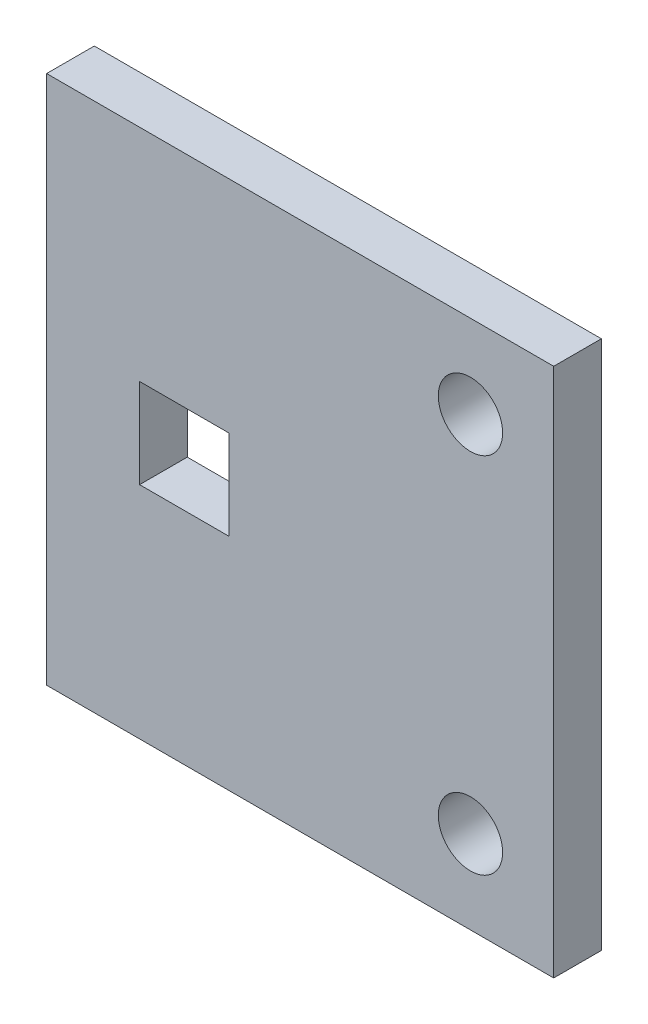
ISO-10303-21;
HEADER;
FILE_DESCRIPTION(('STEP AP214'),'2;1');
FILE_NAME('part.step','',(''),(''),'','','');
FILE_SCHEMA(('AUTOMOTIVE_DESIGN { 1 0 10303 214 1 1 1 1 }'));
ENDSEC;
DATA;
#1=APPLICATION_CONTEXT('core data for automotive mechanical design processes');
#2=APPLICATION_PROTOCOL_DEFINITION('international standard','automotive_design',2000,#1);
#3=PRODUCT_CONTEXT('',#1,'mechanical');
#4=PRODUCT('Part','Part','',(#3));
#5=PRODUCT_RELATED_PRODUCT_CATEGORY('part','',(#4));
#6=PRODUCT_DEFINITION_FORMATION('','',#4);
#7=PRODUCT_DEFINITION_CONTEXT('part definition',#1,'design');
#8=PRODUCT_DEFINITION('design','',#6,#7);
#9=PRODUCT_DEFINITION_SHAPE('','',#8);
#10=(LENGTH_UNIT() NAMED_UNIT(*) SI_UNIT(.MILLI.,.METRE.));
#11=(NAMED_UNIT(*) PLANE_ANGLE_UNIT() SI_UNIT($,.RADIAN.));
#12=(NAMED_UNIT(*) SI_UNIT($,.STERADIAN.) SOLID_ANGLE_UNIT());
#13=UNCERTAINTY_MEASURE_WITH_UNIT(LENGTH_MEASURE(1.E-05),#10,'distance_accuracy_value','');
#14=(GEOMETRIC_REPRESENTATION_CONTEXT(3) GLOBAL_UNCERTAINTY_ASSIGNED_CONTEXT((#13)) GLOBAL_UNIT_ASSIGNED_CONTEXT((#10,
#11,#12)) REPRESENTATION_CONTEXT('',''));
#15=CARTESIAN_POINT('',(0.,0.,0.));
#16=DIRECTION('',(0.,0.,1.));
#17=DIRECTION('',(1.,0.,0.));
#18=AXIS2_PLACEMENT_3D('',#15,#16,#17);
#19=CARTESIAN_POINT('',(-5.389,0.,1.6));
#20=DIRECTION('',(1.,0.,0.));
#21=DIRECTION('',(0.,0.,-1.));
#22=AXIS2_PLACEMENT_3D('',#19,#20,#21);
#23=PLANE('',#22);
#24=DIRECTION('',(0.,-1.,0.));
#25=VECTOR('',#24,1.);
#26=CARTESIAN_POINT('',(-5.389,0.,0.));
#27=LINE('',#26,#25);
#28=CARTESIAN_POINT('',(-5.389,1.5,0.));
#29=VERTEX_POINT('',#28);
#30=CARTESIAN_POINT('',(-5.389,-1.5,0.));
#31=VERTEX_POINT('',#30);
#32=EDGE_CURVE('E156',#29,#31,#27,.T.);
#33=ORIENTED_EDGE('',*,*,#32,.F.);
#34=DIRECTION('',(0.,0.,-1.));
#35=VECTOR('',#34,1.);
#36=CARTESIAN_POINT('',(-5.389,1.5,1.6));
#37=LINE('',#36,#35);
#38=CARTESIAN_POINT('',(-5.389,1.5,1.6));
#39=VERTEX_POINT('',#38);
#40=EDGE_CURVE('E11',#39,#29,#37,.T.);
#41=ORIENTED_EDGE('',*,*,#40,.F.);
#42=DIRECTION('',(0.,-1.,0.));
#43=VECTOR('',#42,1.);
#44=CARTESIAN_POINT('',(-5.389,0.,1.6));
#45=LINE('',#44,#43);
#46=CARTESIAN_POINT('',(-5.389,-1.5,1.6));
#47=VERTEX_POINT('',#46);
#48=EDGE_CURVE('E130',#39,#47,#45,.T.);
#49=ORIENTED_EDGE('',*,*,#48,.T.);
#50=DIRECTION('',(0.,0.,-1.));
#51=VECTOR('',#50,1.);
#52=CARTESIAN_POINT('',(-5.389,-1.5,1.6));
#53=LINE('',#52,#51);
#54=EDGE_CURVE('E90',#47,#31,#53,.T.);
#55=ORIENTED_EDGE('',*,*,#54,.T.);
#56=EDGE_LOOP('',(#33,#41,#49,#55));
#57=FACE_BOUND('',#56,.T.);
#58=ADVANCED_FACE('F36',(#57),#23,.T.);
#59=CARTESIAN_POINT('',(0.,1.5,1.6));
#60=DIRECTION('',(0.,-1.,0.));
#61=DIRECTION('',(1.,0.,0.));
#62=AXIS2_PLACEMENT_3D('',#59,#60,#61);
#63=PLANE('',#62);
#64=DIRECTION('',(-1.,0.,0.));
#65=VECTOR('',#64,1.);
#66=CARTESIAN_POINT('',(0.,1.5,0.));
#67=LINE('',#66,#65);
#68=CARTESIAN_POINT('',(-2.389,1.5,0.));
#69=VERTEX_POINT('',#68);
#70=EDGE_CURVE('E119',#69,#29,#67,.T.);
#71=ORIENTED_EDGE('',*,*,#70,.F.);
#72=DIRECTION('',(0.,0.,-1.));
#73=VECTOR('',#72,1.);
#74=CARTESIAN_POINT('',(-2.389,1.5,1.6));
#75=LINE('',#74,#73);
#76=CARTESIAN_POINT('',(-2.389,1.5,1.6));
#77=VERTEX_POINT('',#76);
#78=EDGE_CURVE('E46',#77,#69,#75,.T.);
#79=ORIENTED_EDGE('',*,*,#78,.F.);
#80=DIRECTION('',(-1.,0.,0.));
#81=VECTOR('',#80,1.);
#82=CARTESIAN_POINT('',(0.,1.5,1.6));
#83=LINE('',#82,#81);
#84=EDGE_CURVE('E117',#77,#39,#83,.T.);
#85=ORIENTED_EDGE('',*,*,#84,.T.);
#86=ORIENTED_EDGE('',*,*,#40,.T.);
#87=EDGE_LOOP('',(#71,#79,#85,#86));
#88=FACE_BOUND('',#87,.T.);
#89=ADVANCED_FACE('F115',(#88),#63,.T.);
#90=CARTESIAN_POINT('',(-2.389,0.,1.6));
#91=DIRECTION('',(1.,0.,0.));
#92=DIRECTION('',(0.,0.,-1.));
#93=AXIS2_PLACEMENT_3D('',#90,#91,#92);
#94=PLANE('',#93);
#95=DIRECTION('',(0.,-1.,0.));
#96=VECTOR('',#95,1.);
#97=CARTESIAN_POINT('',(-2.389,0.,0.));
#98=LINE('',#97,#96);
#99=CARTESIAN_POINT('',(-2.389,-1.5,0.));
#100=VERTEX_POINT('',#99);
#101=EDGE_CURVE('E159',#69,#100,#98,.T.);
#102=ORIENTED_EDGE('',*,*,#101,.T.);
#103=DIRECTION('',(0.,0.,-1.));
#104=VECTOR('',#103,1.);
#105=CARTESIAN_POINT('',(-2.389,-1.5,1.6));
#106=LINE('',#105,#104);
#107=CARTESIAN_POINT('',(-2.389,-1.5,1.6));
#108=VERTEX_POINT('',#107);
#109=EDGE_CURVE('E122',#108,#100,#106,.T.);
#110=ORIENTED_EDGE('',*,*,#109,.F.);
#111=DIRECTION('',(0.,-1.,0.));
#112=VECTOR('',#111,1.);
#113=CARTESIAN_POINT('',(-2.389,0.,1.6));
#114=LINE('',#113,#112);
#115=EDGE_CURVE('E125',#77,#108,#114,.T.);
#116=ORIENTED_EDGE('',*,*,#115,.F.);
#117=ORIENTED_EDGE('',*,*,#78,.T.);
#118=EDGE_LOOP('',(#102,#110,#116,#117));
#119=FACE_BOUND('',#118,.T.);
#120=ADVANCED_FACE('F126',(#119),#94,.F.);
#121=CARTESIAN_POINT('',(0.,-8.89,1.6));
#122=DIRECTION('',(0.,1.,0.));
#123=DIRECTION('',(0.,0.,1.));
#124=AXIS2_PLACEMENT_3D('',#121,#122,#123);
#125=PLANE('',#124);
#126=DIRECTION('',(1.,0.,0.));
#127=VECTOR('',#126,1.);
#128=CARTESIAN_POINT('',(0.,-8.89,0.));
#129=LINE('',#128,#127);
#130=CARTESIAN_POINT('',(-8.509,-8.89,0.));
#131=VERTEX_POINT('',#130);
#132=CARTESIAN_POINT('',(8.509,-8.89,0.));
#133=VERTEX_POINT('',#132);
#134=EDGE_CURVE('E144',#131,#133,#129,.T.);
#135=ORIENTED_EDGE('',*,*,#134,.T.);
#136=DIRECTION('',(0.,0.,-1.));
#137=VECTOR('',#136,1.);
#138=CARTESIAN_POINT('',(8.509,-8.89,1.6));
#139=LINE('',#138,#137);
#140=CARTESIAN_POINT('',(8.509,-8.89,1.6));
#141=VERTEX_POINT('',#140);
#142=EDGE_CURVE('E40',#141,#133,#139,.T.);
#143=ORIENTED_EDGE('',*,*,#142,.F.);
#144=DIRECTION('',(1.,0.,0.));
#145=VECTOR('',#144,1.);
#146=CARTESIAN_POINT('',(0.,-8.89,1.6));
#147=LINE('',#146,#145);
#148=CARTESIAN_POINT('',(-8.509,-8.89,1.6));
#149=VERTEX_POINT('',#148);
#150=EDGE_CURVE('E168',#149,#141,#147,.T.);
#151=ORIENTED_EDGE('',*,*,#150,.F.);
#152=DIRECTION('',(0.,0.,-1.));
#153=VECTOR('',#152,1.);
#154=CARTESIAN_POINT('',(-8.509,-8.89,1.6));
#155=LINE('',#154,#153);
#156=EDGE_CURVE('E143',#149,#131,#155,.T.);
#157=ORIENTED_EDGE('',*,*,#156,.T.);
#158=EDGE_LOOP('',(#135,#143,#151,#157));
#159=FACE_BOUND('',#158,.T.);
#160=ADVANCED_FACE('F38',(#159),#125,.F.);
#161=CARTESIAN_POINT('',(8.509,0.,1.6));
#162=DIRECTION('',(-1.,0.,0.));
#163=DIRECTION('',(0.,0.,1.));
#164=AXIS2_PLACEMENT_3D('',#161,#162,#163);
#165=PLANE('',#164);
#166=DIRECTION('',(0.,1.,0.));
#167=VECTOR('',#166,1.);
#168=CARTESIAN_POINT('',(8.509,0.,0.));
#169=LINE('',#168,#167);
#170=CARTESIAN_POINT('',(8.509,8.89,0.));
#171=VERTEX_POINT('',#170);
#172=EDGE_CURVE('E147',#133,#171,#169,.T.);
#173=ORIENTED_EDGE('',*,*,#172,.T.);
#174=DIRECTION('',(0.,0.,-1.));
#175=VECTOR('',#174,1.);
#176=CARTESIAN_POINT('',(8.509,8.89,1.6));
#177=LINE('',#176,#175);
#178=CARTESIAN_POINT('',(8.509,8.89,1.6));
#179=VERTEX_POINT('',#178);
#180=EDGE_CURVE('E173',#179,#171,#177,.T.);
#181=ORIENTED_EDGE('',*,*,#180,.F.);
#182=DIRECTION('',(0.,1.,0.));
#183=VECTOR('',#182,1.);
#184=CARTESIAN_POINT('',(8.509,0.,1.6));
#185=LINE('',#184,#183);
#186=EDGE_CURVE('E98',#141,#179,#185,.T.);
#187=ORIENTED_EDGE('',*,*,#186,.F.);
#188=ORIENTED_EDGE('',*,*,#142,.T.);
#189=EDGE_LOOP('',(#173,#181,#187,#188));
#190=FACE_BOUND('',#189,.T.);
#191=ADVANCED_FACE('F178',(#190),#165,.F.);
#192=CARTESIAN_POINT('',(0.,8.89,1.6));
#193=DIRECTION('',(0.,1.,0.));
#194=DIRECTION('',(0.,0.,1.));
#195=AXIS2_PLACEMENT_3D('',#192,#193,#194);
#196=PLANE('',#195);
#197=DIRECTION('',(1.,0.,0.));
#198=VECTOR('',#197,1.);
#199=CARTESIAN_POINT('',(0.,8.89,0.));
#200=LINE('',#199,#198);
#201=CARTESIAN_POINT('',(-8.509,8.89,0.));
#202=VERTEX_POINT('',#201);
#203=EDGE_CURVE('E150',#202,#171,#200,.T.);
#204=ORIENTED_EDGE('',*,*,#203,.F.);
#205=DIRECTION('',(0.,0.,-1.));
#206=VECTOR('',#205,1.);
#207=CARTESIAN_POINT('',(-8.509,8.89,1.6));
#208=LINE('',#207,#206);
#209=CARTESIAN_POINT('',(-8.509,8.89,1.6));
#210=VERTEX_POINT('',#209);
#211=EDGE_CURVE('E172',#210,#202,#208,.T.);
#212=ORIENTED_EDGE('',*,*,#211,.F.);
#213=DIRECTION('',(1.,0.,0.));
#214=VECTOR('',#213,1.);
#215=CARTESIAN_POINT('',(0.,8.89,1.6));
#216=LINE('',#215,#214);
#217=EDGE_CURVE('E279',#210,#179,#216,.T.);
#218=ORIENTED_EDGE('',*,*,#217,.T.);
#219=ORIENTED_EDGE('',*,*,#180,.T.);
#220=EDGE_LOOP('',(#204,#212,#218,#219));
#221=FACE_BOUND('',#220,.T.);
#222=ADVANCED_FACE('F190',(#221),#196,.T.);
#223=CARTESIAN_POINT('',(5.715,6.096,1.6));
#224=DIRECTION('',(0.,0.,-1.));
#225=DIRECTION('',(-1.,0.,0.));
#226=AXIS2_PLACEMENT_3D('',#223,#224,#225);
#227=CYLINDRICAL_SURFACE('',#226,1.0795);
#228=CARTESIAN_POINT('',(5.715,6.096,1.6));
#229=DIRECTION('',(0.,0.,1.));
#230=DIRECTION('',(1.,0.,0.));
#231=AXIS2_PLACEMENT_3D('',#228,#229,#230);
#232=CIRCLE('',#231,1.0795);
#233=CARTESIAN_POINT('',(6.7945,6.096,1.6));
#234=VERTEX_POINT('',#233);
#235=EDGE_CURVE('E137',#234,#234,#232,.T.);
#236=ORIENTED_EDGE('',*,*,#235,.T.);
#237=EDGE_LOOP('',(#236));
#238=FACE_BOUND('',#237,.T.);
#239=CARTESIAN_POINT('',(5.715,6.096,0.));
#240=DIRECTION('',(0.,0.,1.));
#241=DIRECTION('',(1.,0.,0.));
#242=AXIS2_PLACEMENT_3D('',#239,#240,#241);
#243=CIRCLE('',#242,1.0795);
#244=CARTESIAN_POINT('',(6.7945,6.096,0.));
#245=VERTEX_POINT('',#244);
#246=EDGE_CURVE('E162',#245,#245,#243,.T.);
#247=ORIENTED_EDGE('',*,*,#246,.F.);
#248=EDGE_LOOP('',(#247));
#249=FACE_BOUND('',#248,.T.);
#250=ADVANCED_FACE('F192',(#238,#249),#227,.F.);
#251=CARTESIAN_POINT('',(0.,-1.5,1.6));
#252=DIRECTION('',(0.,-1.,0.));
#253=DIRECTION('',(1.,0.,0.));
#254=AXIS2_PLACEMENT_3D('',#251,#252,#253);
#255=PLANE('',#254);
#256=DIRECTION('',(-1.,0.,0.));
#257=VECTOR('',#256,1.);
#258=CARTESIAN_POINT('',(0.,-1.5,0.));
#259=LINE('',#258,#257);
#260=EDGE_CURVE('E83',#100,#31,#259,.T.);
#261=ORIENTED_EDGE('',*,*,#260,.T.);
#262=ORIENTED_EDGE('',*,*,#54,.F.);
#263=DIRECTION('',(-1.,0.,0.));
#264=VECTOR('',#263,1.);
#265=CARTESIAN_POINT('',(0.,-1.5,1.6));
#266=LINE('',#265,#264);
#267=EDGE_CURVE('E55',#108,#47,#266,.T.);
#268=ORIENTED_EDGE('',*,*,#267,.F.);
#269=ORIENTED_EDGE('',*,*,#109,.T.);
#270=EDGE_LOOP('',(#261,#262,#268,#269));
#271=FACE_BOUND('',#270,.T.);
#272=ADVANCED_FACE('F198',(#271),#255,.F.);
#273=CARTESIAN_POINT('',(-8.509,0.,1.6));
#274=DIRECTION('',(-1.,0.,0.));
#275=DIRECTION('',(0.,0.,1.));
#276=AXIS2_PLACEMENT_3D('',#273,#274,#275);
#277=PLANE('',#276);
#278=DIRECTION('',(0.,1.,0.));
#279=VECTOR('',#278,1.);
#280=CARTESIAN_POINT('',(-8.509,0.,0.));
#281=LINE('',#280,#279);
#282=EDGE_CURVE('E153',#131,#202,#281,.T.);
#283=ORIENTED_EDGE('',*,*,#282,.F.);
#284=ORIENTED_EDGE('',*,*,#156,.F.);
#285=DIRECTION('',(0.,1.,0.));
#286=VECTOR('',#285,1.);
#287=CARTESIAN_POINT('',(-8.509,0.,1.6));
#288=LINE('',#287,#286);
#289=EDGE_CURVE('E132',#149,#210,#288,.T.);
#290=ORIENTED_EDGE('',*,*,#289,.T.);
#291=ORIENTED_EDGE('',*,*,#211,.T.);
#292=EDGE_LOOP('',(#283,#284,#290,#291));
#293=FACE_BOUND('',#292,.T.);
#294=ADVANCED_FACE('F186',(#293),#277,.T.);
#295=CARTESIAN_POINT('',(5.715,-6.096,1.6));
#296=DIRECTION('',(0.,0.,-1.));
#297=DIRECTION('',(-1.,0.,0.));
#298=AXIS2_PLACEMENT_3D('',#295,#296,#297);
#299=CYLINDRICAL_SURFACE('',#298,1.0795);
#300=CARTESIAN_POINT('',(5.715,-6.096,1.6));
#301=DIRECTION('',(0.,0.,1.));
#302=DIRECTION('',(1.,0.,0.));
#303=AXIS2_PLACEMENT_3D('',#300,#301,#302);
#304=CIRCLE('',#303,1.0795);
#305=CARTESIAN_POINT('',(6.7945,-6.096,1.6));
#306=VERTEX_POINT('',#305);
#307=EDGE_CURVE('E140',#306,#306,#304,.F.);
#308=ORIENTED_EDGE('',*,*,#307,.F.);
#309=EDGE_LOOP('',(#308));
#310=FACE_BOUND('',#309,.T.);
#311=CARTESIAN_POINT('',(5.715,-6.096,0.));
#312=DIRECTION('',(0.,0.,1.));
#313=DIRECTION('',(1.,0.,0.));
#314=AXIS2_PLACEMENT_3D('',#311,#312,#313);
#315=CIRCLE('',#314,1.0795);
#316=CARTESIAN_POINT('',(6.7945,-6.096,0.));
#317=VERTEX_POINT('',#316);
#318=EDGE_CURVE('E165',#317,#317,#315,.F.);
#319=ORIENTED_EDGE('',*,*,#318,.T.);
#320=EDGE_LOOP('',(#319));
#321=FACE_BOUND('',#320,.T.);
#322=ADVANCED_FACE('F210',(#310,#321),#299,.F.);
#323=CARTESIAN_POINT('',(0.,0.,1.6));
#324=DIRECTION('',(0.,0.,1.));
#325=DIRECTION('',(1.,0.,0.));
#326=AXIS2_PLACEMENT_3D('',#323,#324,#325);
#327=PLANE('',#326);
#328=ORIENTED_EDGE('',*,*,#150,.T.);
#329=ORIENTED_EDGE('',*,*,#186,.T.);
#330=ORIENTED_EDGE('',*,*,#217,.F.);
#331=ORIENTED_EDGE('',*,*,#289,.F.);
#332=EDGE_LOOP('',(#328,#329,#330,#331));
#333=FACE_BOUND('',#332,.T.);
#334=ORIENTED_EDGE('',*,*,#48,.F.);
#335=ORIENTED_EDGE('',*,*,#84,.F.);
#336=ORIENTED_EDGE('',*,*,#115,.T.);
#337=ORIENTED_EDGE('',*,*,#267,.T.);
#338=EDGE_LOOP('',(#334,#335,#336,#337));
#339=FACE_BOUND('',#338,.T.);
#340=ORIENTED_EDGE('',*,*,#235,.F.);
#341=EDGE_LOOP('',(#340));
#342=FACE_BOUND('',#341,.T.);
#343=ORIENTED_EDGE('',*,*,#307,.T.);
#344=EDGE_LOOP('',(#343));
#345=FACE_BOUND('',#344,.T.);
#346=ADVANCED_FACE('F128',(#333,#339,#342,#345),#327,.T.);
#347=CARTESIAN_POINT('',(0.,0.,0.));
#348=DIRECTION('',(0.,0.,1.));
#349=DIRECTION('',(1.,0.,0.));
#350=AXIS2_PLACEMENT_3D('',#347,#348,#349);
#351=PLANE('',#350);
#352=ORIENTED_EDGE('',*,*,#134,.F.);
#353=ORIENTED_EDGE('',*,*,#282,.T.);
#354=ORIENTED_EDGE('',*,*,#203,.T.);
#355=ORIENTED_EDGE('',*,*,#172,.F.);
#356=EDGE_LOOP('',(#352,#353,#354,#355));
#357=FACE_BOUND('',#356,.T.);
#358=ORIENTED_EDGE('',*,*,#32,.T.);
#359=ORIENTED_EDGE('',*,*,#260,.F.);
#360=ORIENTED_EDGE('',*,*,#101,.F.);
#361=ORIENTED_EDGE('',*,*,#70,.T.);
#362=EDGE_LOOP('',(#358,#359,#360,#361));
#363=FACE_BOUND('',#362,.T.);
#364=ORIENTED_EDGE('',*,*,#246,.T.);
#365=EDGE_LOOP('',(#364));
#366=FACE_BOUND('',#365,.T.);
#367=ORIENTED_EDGE('',*,*,#318,.F.);
#368=EDGE_LOOP('',(#367));
#369=FACE_BOUND('',#368,.T.);
#370=ADVANCED_FACE('F184',(#357,#363,#366,#369),#351,.F.);
#371=CLOSED_SHELL('',(#58,#89,#120,#160,#191,#222,#250,#272,#294,#322,#346,#370));
#372=MANIFOLD_SOLID_BREP('B2',#371);
#373=ADVANCED_BREP_SHAPE_REPRESENTATION('',(#18,#372),#14);
#374=SHAPE_DEFINITION_REPRESENTATION(#9,#373);
ENDSEC;
END-ISO-10303-21;
